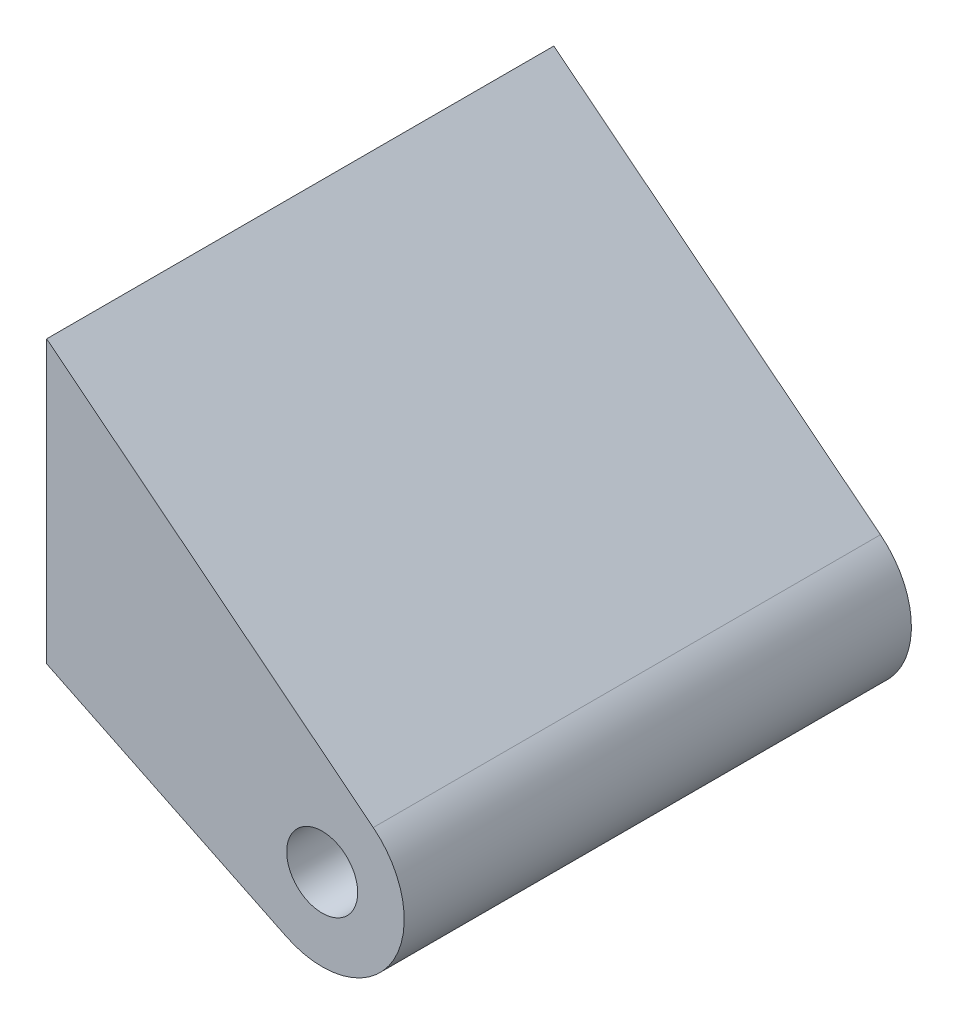
ISO-10303-21;
HEADER;
FILE_DESCRIPTION(('STEP AP214'),'2;1');
FILE_NAME('part.step','',(''),(''),'','','');
FILE_SCHEMA(('AUTOMOTIVE_DESIGN { 1 0 10303 214 1 1 1 1 }'));
ENDSEC;
DATA;
#1=APPLICATION_CONTEXT('core data for automotive mechanical design processes');
#2=APPLICATION_PROTOCOL_DEFINITION('international standard','automotive_design',2000,#1);
#3=PRODUCT_CONTEXT('',#1,'mechanical');
#4=PRODUCT('Part','Part','',(#3));
#5=PRODUCT_RELATED_PRODUCT_CATEGORY('part','',(#4));
#6=PRODUCT_DEFINITION_FORMATION('','',#4);
#7=PRODUCT_DEFINITION_CONTEXT('part definition',#1,'design');
#8=PRODUCT_DEFINITION('design','',#6,#7);
#9=PRODUCT_DEFINITION_SHAPE('','',#8);
#10=(LENGTH_UNIT() NAMED_UNIT(*) SI_UNIT(.MILLI.,.METRE.));
#11=(NAMED_UNIT(*) PLANE_ANGLE_UNIT() SI_UNIT($,.RADIAN.));
#12=(NAMED_UNIT(*) SI_UNIT($,.STERADIAN.) SOLID_ANGLE_UNIT());
#13=UNCERTAINTY_MEASURE_WITH_UNIT(LENGTH_MEASURE(1.E-05),#10,'distance_accuracy_value','');
#14=(GEOMETRIC_REPRESENTATION_CONTEXT(3) GLOBAL_UNCERTAINTY_ASSIGNED_CONTEXT((#13)) GLOBAL_UNIT_ASSIGNED_CONTEXT((#10,
#11,#12)) REPRESENTATION_CONTEXT('',''));
#15=CARTESIAN_POINT('',(0.,0.,0.));
#16=DIRECTION('',(0.,0.,1.));
#17=DIRECTION('',(1.,0.,0.));
#18=AXIS2_PLACEMENT_3D('',#15,#16,#17);
#19=CARTESIAN_POINT('',(-5.03350795315366,-6.32536784056477,50.));
#20=DIRECTION('',(0.,0.,-1.));
#21=DIRECTION('',(-1.,0.,0.));
#22=AXIS2_PLACEMENT_3D('',#19,#20,#21);
#23=PLANE('',#22);
#24=DIRECTION('',(0.,-1.,0.));
#25=VECTOR('',#24,1.);
#26=CARTESIAN_POINT('',(-32.1980127426444,25.6220598233814,50.));
#27=LINE('',#26,#25);
#28=CARTESIAN_POINT('',(-32.1980127426444,25.6220598233814,50.));
#29=VERTEX_POINT('',#28);
#30=CARTESIAN_POINT('',(-32.1980127426444,-2.12009386717044,50.));
#31=VERTEX_POINT('',#30);
#32=EDGE_CURVE('E85',#29,#31,#27,.T.);
#33=ORIENTED_EDGE('',*,*,#32,.T.);
#34=DIRECTION('',(0.899539495769596,-0.436839439097,0.));
#35=VECTOR('',#34,1.);
#36=CARTESIAN_POINT('',(-32.1980127426444,-2.12009386717044,50.));
#37=LINE('',#36,#35);
#38=CARTESIAN_POINT('',(-8.56479435586867,-13.596990560076,50.));
#39=VERTEX_POINT('',#38);
#40=EDGE_CURVE('E80',#31,#39,#37,.T.);
#41=ORIENTED_EDGE('',*,*,#40,.T.);
#42=CARTESIAN_POINT('',(-5.03350795315366,-6.32536784056477,50.));
#43=DIRECTION('',(0.,0.,1.));
#44=DIRECTION('',(-1.,0.,0.));
#45=AXIS2_PLACEMENT_3D('',#42,#43,#44);
#46=CIRCLE('',#45,8.08371700598877);
#47=CARTESIAN_POINT('',(0.,0.,50.));
#48=VERTEX_POINT('',#47);
#49=EDGE_CURVE('E83',#39,#48,#46,.T.);
#50=ORIENTED_EDGE('',*,*,#49,.T.);
#51=DIRECTION('',(-0.782482592584409,0.622672459887526,0.));
#52=VECTOR('',#51,1.);
#53=CARTESIAN_POINT('',(-32.1980127426444,25.6220598233814,50.));
#54=LINE('',#53,#52);
#55=EDGE_CURVE('E50',#48,#29,#54,.T.);
#56=ORIENTED_EDGE('',*,*,#55,.T.);
#57=EDGE_LOOP('',(#33,#41,#50,#56));
#58=FACE_BOUND('',#57,.T.);
#59=CARTESIAN_POINT('',(-5.03350795315366,-6.32536784056477,50.));
#60=DIRECTION('',(0.,0.,1.));
#61=DIRECTION('',(1.,0.,0.));
#62=AXIS2_PLACEMENT_3D('',#59,#60,#61);
#63=CIRCLE('',#62,3.5);
#64=CARTESIAN_POINT('',(-1.53350795315366,-6.32536784056477,50.));
#65=VERTEX_POINT('',#64);
#66=EDGE_CURVE('E100',#65,#65,#63,.T.);
#67=ORIENTED_EDGE('',*,*,#66,.F.);
#68=EDGE_LOOP('',(#67));
#69=FACE_BOUND('',#68,.T.);
#70=ADVANCED_FACE('F33',(#58,#69),#23,.F.);
#71=CARTESIAN_POINT('',(-5.03350795315366,-6.32536784056477,0.));
#72=DIRECTION('',(0.,0.,-1.));
#73=DIRECTION('',(-1.,0.,0.));
#74=AXIS2_PLACEMENT_3D('',#71,#72,#73);
#75=PLANE('',#74);
#76=DIRECTION('',(0.,-1.,0.));
#77=VECTOR('',#76,1.);
#78=CARTESIAN_POINT('',(-32.1980127426444,25.6220598233814,0.));
#79=LINE('',#78,#77);
#80=CARTESIAN_POINT('',(-32.1980127426444,25.6220598233814,0.));
#81=VERTEX_POINT('',#80);
#82=CARTESIAN_POINT('',(-32.1980127426444,-2.12009386717044,0.));
#83=VERTEX_POINT('',#82);
#84=EDGE_CURVE('E97',#81,#83,#79,.T.);
#85=ORIENTED_EDGE('',*,*,#84,.F.);
#86=DIRECTION('',(-0.782482592584409,0.622672459887526,0.));
#87=VECTOR('',#86,1.);
#88=CARTESIAN_POINT('',(-32.1980127426444,25.6220598233814,0.));
#89=LINE('',#88,#87);
#90=CARTESIAN_POINT('',(0.,0.,0.));
#91=VERTEX_POINT('',#90);
#92=EDGE_CURVE('E73',#91,#81,#89,.T.);
#93=ORIENTED_EDGE('',*,*,#92,.F.);
#94=CARTESIAN_POINT('',(-5.03350795315366,-6.32536784056477,0.));
#95=DIRECTION('',(0.,0.,1.));
#96=DIRECTION('',(-1.,0.,0.));
#97=AXIS2_PLACEMENT_3D('',#94,#95,#96);
#98=CIRCLE('',#97,8.08371700598877);
#99=CARTESIAN_POINT('',(-8.56479435586867,-13.596990560076,0.));
#100=VERTEX_POINT('',#99);
#101=EDGE_CURVE('E67',#100,#91,#98,.T.);
#102=ORIENTED_EDGE('',*,*,#101,.F.);
#103=DIRECTION('',(0.899539495769596,-0.436839439097,0.));
#104=VECTOR('',#103,1.);
#105=CARTESIAN_POINT('',(-32.1980127426444,-2.12009386717044,0.));
#106=LINE('',#105,#104);
#107=EDGE_CURVE('E89',#83,#100,#106,.T.);
#108=ORIENTED_EDGE('',*,*,#107,.F.);
#109=EDGE_LOOP('',(#85,#93,#102,#108));
#110=FACE_BOUND('',#109,.T.);
#111=CARTESIAN_POINT('',(-5.03350795315366,-6.32536784056477,0.));
#112=DIRECTION('',(0.,0.,1.));
#113=DIRECTION('',(1.,0.,0.));
#114=AXIS2_PLACEMENT_3D('',#111,#112,#113);
#115=CIRCLE('',#114,3.5);
#116=CARTESIAN_POINT('',(-1.53350795315366,-6.32536784056477,0.));
#117=VERTEX_POINT('',#116);
#118=EDGE_CURVE('E112',#117,#117,#115,.T.);
#119=ORIENTED_EDGE('',*,*,#118,.T.);
#120=EDGE_LOOP('',(#119));
#121=FACE_BOUND('',#120,.T.);
#122=ADVANCED_FACE('F108',(#110,#121),#75,.T.);
#123=CARTESIAN_POINT('',(-32.1980127426444,25.6220598233814,50.));
#124=DIRECTION('',(1.,0.,0.));
#125=DIRECTION('',(0.,0.,-1.));
#126=AXIS2_PLACEMENT_3D('',#123,#124,#125);
#127=PLANE('',#126);
#128=ORIENTED_EDGE('',*,*,#84,.T.);
#129=DIRECTION('',(0.,0.,-1.));
#130=VECTOR('',#129,1.);
#131=CARTESIAN_POINT('',(-32.1980127426444,-2.12009386717044,50.));
#132=LINE('',#131,#130);
#133=EDGE_CURVE('E11',#31,#83,#132,.T.);
#134=ORIENTED_EDGE('',*,*,#133,.F.);
#135=ORIENTED_EDGE('',*,*,#32,.F.);
#136=DIRECTION('',(0.,0.,-1.));
#137=VECTOR('',#136,1.);
#138=CARTESIAN_POINT('',(-32.1980127426444,25.6220598233814,50.));
#139=LINE('',#138,#137);
#140=EDGE_CURVE('E93',#29,#81,#139,.T.);
#141=ORIENTED_EDGE('',*,*,#140,.T.);
#142=EDGE_LOOP('',(#128,#134,#135,#141));
#143=FACE_BOUND('',#142,.T.);
#144=ADVANCED_FACE('F35',(#143),#127,.F.);
#145=CARTESIAN_POINT('',(-32.1980127426444,-2.12009386717044,50.));
#146=DIRECTION('',(0.436839439097,0.899539495769596,0.));
#147=DIRECTION('',(-0.899539495769596,0.436839439097,0.));
#148=AXIS2_PLACEMENT_3D('',#145,#146,#147);
#149=PLANE('',#148);
#150=ORIENTED_EDGE('',*,*,#107,.T.);
#151=DIRECTION('',(0.,0.,-1.));
#152=VECTOR('',#151,1.);
#153=CARTESIAN_POINT('',(-8.56479435586867,-13.596990560076,50.));
#154=LINE('',#153,#152);
#155=EDGE_CURVE('E42',#39,#100,#154,.T.);
#156=ORIENTED_EDGE('',*,*,#155,.F.);
#157=ORIENTED_EDGE('',*,*,#40,.F.);
#158=ORIENTED_EDGE('',*,*,#133,.T.);
#159=EDGE_LOOP('',(#150,#156,#157,#158));
#160=FACE_BOUND('',#159,.T.);
#161=ADVANCED_FACE('F88',(#160),#149,.F.);
#162=CARTESIAN_POINT('',(-5.03350795315366,-6.32536784056477,50.));
#163=DIRECTION('',(0.,0.,-1.));
#164=DIRECTION('',(-1.,0.,0.));
#165=AXIS2_PLACEMENT_3D('',#162,#163,#164);
#166=CYLINDRICAL_SURFACE('',#165,8.08371700598877);
#167=ORIENTED_EDGE('',*,*,#101,.T.);
#168=DIRECTION('',(0.,0.,-1.));
#169=VECTOR('',#168,1.);
#170=CARTESIAN_POINT('',(0.,0.,50.));
#171=LINE('',#170,#169);
#172=EDGE_CURVE('E90',#48,#91,#171,.T.);
#173=ORIENTED_EDGE('',*,*,#172,.F.);
#174=ORIENTED_EDGE('',*,*,#49,.F.);
#175=ORIENTED_EDGE('',*,*,#155,.T.);
#176=EDGE_LOOP('',(#167,#173,#174,#175));
#177=FACE_BOUND('',#176,.T.);
#178=ADVANCED_FACE('F91',(#177),#166,.T.);
#179=CARTESIAN_POINT('',(-32.1980127426444,25.6220598233814,50.));
#180=DIRECTION('',(-0.622672459887526,-0.782482592584409,0.));
#181=DIRECTION('',(0.782482592584409,-0.622672459887526,0.));
#182=AXIS2_PLACEMENT_3D('',#179,#180,#181);
#183=PLANE('',#182);
#184=ORIENTED_EDGE('',*,*,#92,.T.);
#185=ORIENTED_EDGE('',*,*,#140,.F.);
#186=ORIENTED_EDGE('',*,*,#55,.F.);
#187=ORIENTED_EDGE('',*,*,#172,.T.);
#188=EDGE_LOOP('',(#184,#185,#186,#187));
#189=FACE_BOUND('',#188,.T.);
#190=ADVANCED_FACE('F105',(#189),#183,.F.);
#191=CARTESIAN_POINT('',(-5.03350795315366,-6.32536784056477,50.));
#192=DIRECTION('',(0.,0.,-1.));
#193=DIRECTION('',(-1.,0.,0.));
#194=AXIS2_PLACEMENT_3D('',#191,#192,#193);
#195=CYLINDRICAL_SURFACE('',#194,3.5);
#196=ORIENTED_EDGE('',*,*,#66,.T.);
#197=EDGE_LOOP('',(#196));
#198=FACE_BOUND('',#197,.T.);
#199=ORIENTED_EDGE('',*,*,#118,.F.);
#200=EDGE_LOOP('',(#199));
#201=FACE_BOUND('',#200,.T.);
#202=ADVANCED_FACE('F118',(#198,#201),#195,.F.);
#203=CLOSED_SHELL('',(#70,#122,#144,#161,#178,#190,#202));
#204=MANIFOLD_SOLID_BREP('B2',#203);
#205=ADVANCED_BREP_SHAPE_REPRESENTATION('',(#18,#204),#14);
#206=SHAPE_DEFINITION_REPRESENTATION(#9,#205);
ENDSEC;
END-ISO-10303-21;
